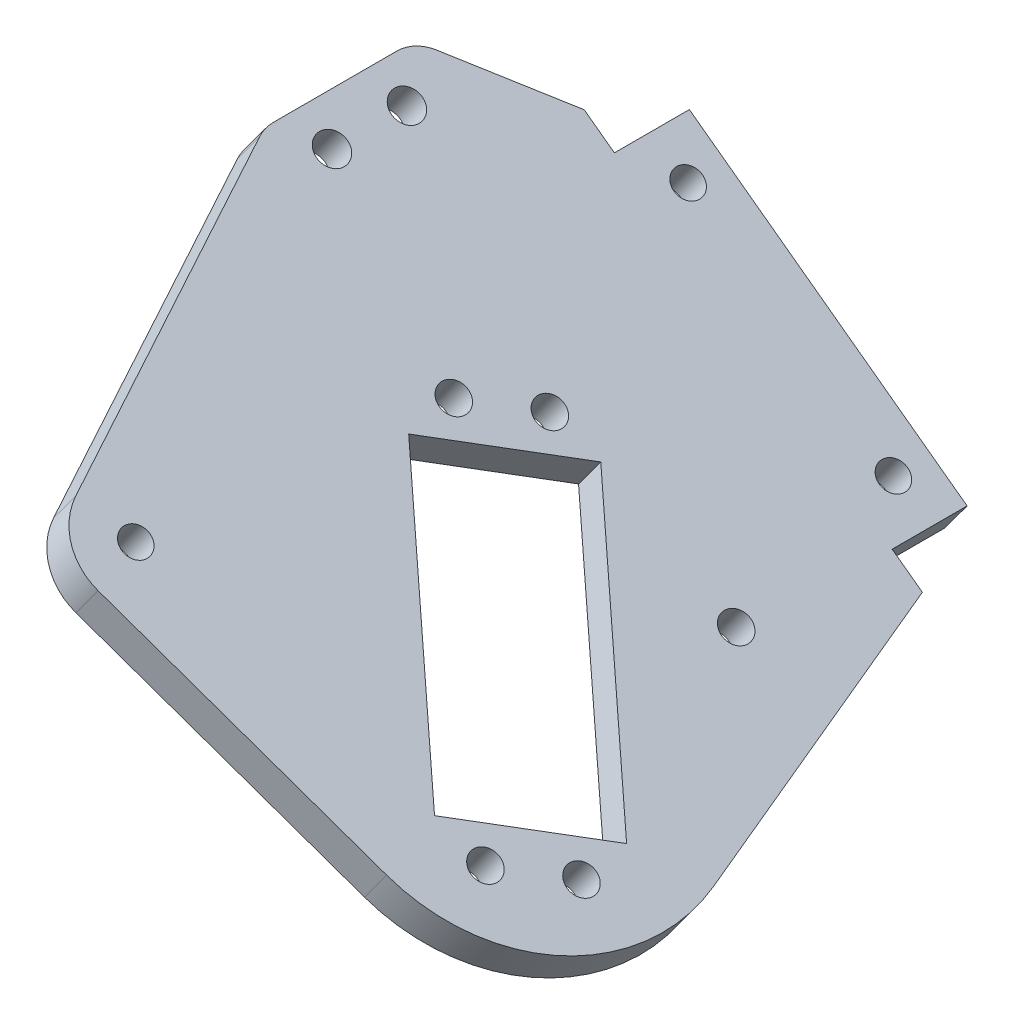
ISO-10303-21;
HEADER;
FILE_DESCRIPTION(('STEP AP214'),'2;1');
FILE_NAME('part.step','',(''),(''),'','','');
FILE_SCHEMA(('AUTOMOTIVE_DESIGN { 1 0 10303 214 1 1 1 1 }'));
ENDSEC;
DATA;
#1=APPLICATION_CONTEXT('core data for automotive mechanical design processes');
#2=APPLICATION_PROTOCOL_DEFINITION('international standard','automotive_design',2000,#1);
#3=PRODUCT_CONTEXT('',#1,'mechanical');
#4=PRODUCT('Part','Part','',(#3));
#5=PRODUCT_RELATED_PRODUCT_CATEGORY('part','',(#4));
#6=PRODUCT_DEFINITION_FORMATION('','',#4);
#7=PRODUCT_DEFINITION_CONTEXT('part definition',#1,'design');
#8=PRODUCT_DEFINITION('design','',#6,#7);
#9=PRODUCT_DEFINITION_SHAPE('','',#8);
#10=(LENGTH_UNIT() NAMED_UNIT(*) SI_UNIT(.MILLI.,.METRE.));
#11=(NAMED_UNIT(*) PLANE_ANGLE_UNIT() SI_UNIT($,.RADIAN.));
#12=(NAMED_UNIT(*) SI_UNIT($,.STERADIAN.) SOLID_ANGLE_UNIT());
#13=UNCERTAINTY_MEASURE_WITH_UNIT(LENGTH_MEASURE(1.E-05),#10,'distance_accuracy_value','');
#14=(GEOMETRIC_REPRESENTATION_CONTEXT(3) GLOBAL_UNCERTAINTY_ASSIGNED_CONTEXT((#13)) GLOBAL_UNIT_ASSIGNED_CONTEXT((#10,
#11,#12)) REPRESENTATION_CONTEXT('',''));
#15=CARTESIAN_POINT('',(0.,0.,0.));
#16=DIRECTION('',(0.,0.,1.));
#17=DIRECTION('',(1.,0.,0.));
#18=AXIS2_PLACEMENT_3D('',#15,#16,#17);
#19=CARTESIAN_POINT('',(-2.56826288802433,-38.4615240936028,78.4668397417343));
#20=DIRECTION('',(-0.592700679914284,-0.805422810720646,0.));
#21=DIRECTION('',(0.805422810720646,-0.592700679914284,0.));
#22=AXIS2_PLACEMENT_3D('',#19,#20,#21);
#23=PLANE('',#22);
#24=CARTESIAN_POINT('',(-30.2783400486142,-18.0700212022658,102.557050068478));
#25=DIRECTION('',(-0.592700679914284,-0.805422810720646,0.));
#26=DIRECTION('',(0.805422810720646,-0.592700679914284,0.));
#27=AXIS2_PLACEMENT_3D('',#24,#25,#26);
#28=CIRCLE('',#27,1.89999999999999);
#29=CARTESIAN_POINT('',(-28.748036708245,-19.1961524941029,102.557050068478));
#30=VERTEX_POINT('',#29);
#31=EDGE_CURVE('E261',#30,#30,#28,.T.);
#32=ORIENTED_EDGE('',*,*,#31,.T.);
#33=EDGE_LOOP('',(#32));
#34=FACE_BOUND('',#33,.T.);
#35=DIRECTION('',(-0.659763741918804,0.485511973603262,-0.573576436351044));
#36=VECTOR('',#35,1.);
#37=CARTESIAN_POINT('',(8.64908998645359,-46.7162352677162,76.0110836623548));
#38=LINE('',#37,#36);
#39=CARTESIAN_POINT('',(8.6490899864536,-46.7162352677162,76.0110836623548));
#40=VERTEX_POINT('',#39);
#41=CARTESIAN_POINT('',(-17.7414596902986,-27.2957563235857,53.068026208313));
#42=VERTEX_POINT('',#41);
#43=EDGE_CURVE('E267',#40,#42,#38,.T.);
#44=ORIENTED_EDGE('',*,*,#43,.F.);
#45=DIRECTION('',(-0.461971545528991,0.339959143808075,0.819152044288993));
#46=VECTOR('',#45,1.);
#47=CARTESIAN_POINT('',(8.64908998645359,-46.7162352677162,76.0110836623548));
#48=LINE('',#47,#46);
#49=CARTESIAN_POINT('',(-0.590340924126203,-39.9170523915547,92.3941245481346));
#50=VERTEX_POINT('',#49);
#51=EDGE_CURVE('E433',#40,#50,#48,.T.);
#52=ORIENTED_EDGE('',*,*,#51,.T.);
#53=DIRECTION('',(-0.659763741918804,0.485511973603262,-0.573576436351044));
#54=VECTOR('',#53,1.);
#55=CARTESIAN_POINT('',(-0.590340924126207,-39.9170523915547,92.3941245481346));
#56=LINE('',#55,#54);
#57=CARTESIAN_POINT('',(-26.9808906008784,-20.4965734474242,69.4510670940928));
#58=VERTEX_POINT('',#57);
#59=EDGE_CURVE('E440',#50,#58,#56,.T.);
#60=ORIENTED_EDGE('',*,*,#59,.T.);
#61=DIRECTION('',(-0.46197154552899,0.339959143808076,0.819152044288993));
#62=VECTOR('',#61,1.);
#63=CARTESIAN_POINT('',(-17.7414596902986,-27.2957563235857,53.068026208313));
#64=LINE('',#63,#62);
#65=EDGE_CURVE('E442',#42,#58,#64,.T.);
#66=ORIENTED_EDGE('',*,*,#65,.F.);
#67=EDGE_LOOP('',(#44,#52,#60,#66));
#68=FACE_BOUND('',#67,.T.);
#69=CARTESIAN_POINT('',(4.68845364215337,-43.8016519918097,90.8794582902694));
#70=DIRECTION('',(-0.592700679914284,-0.805422810720646,0.));
#71=DIRECTION('',(0.805422810720646,-0.592700679914284,0.));
#72=AXIS2_PLACEMENT_3D('',#69,#70,#71);
#73=CIRCLE('',#72,1.94999999999999);
#74=CARTESIAN_POINT('',(6.25902812305863,-44.9574183176426,90.8794582902694));
#75=VERTEX_POINT('',#74);
#76=EDGE_CURVE('E264',#75,#75,#73,.T.);
#77=ORIENTED_EDGE('',*,*,#76,.T.);
#78=EDGE_LOOP('',(#77));
#79=FACE_BOUND('',#78,.T.);
#80=CARTESIAN_POINT('',(9.30816909744327,-47.2012434298905,82.6879378473795));
#81=DIRECTION('',(-0.592700679914284,-0.805422810720646,0.));
#82=DIRECTION('',(0.805422810720646,-0.592700679914284,0.));
#83=AXIS2_PLACEMENT_3D('',#80,#81,#82);
#84=CIRCLE('',#83,1.95);
#85=CARTESIAN_POINT('',(10.8787435783485,-48.3570097557233,82.6879378473795));
#86=VERTEX_POINT('',#85);
#87=EDGE_CURVE('E268',#86,#86,#84,.T.);
#88=ORIENTED_EDGE('',*,*,#87,.T.);
#89=EDGE_LOOP('',(#88));
#90=FACE_BOUND('',#89,.T.);
#91=CARTESIAN_POINT('',(-27.639969711868,-20.0115652852499,62.7742129090682));
#92=DIRECTION('',(-0.592700679914284,-0.805422810720646,0.));
#93=DIRECTION('',(0.805422810720646,-0.592700679914284,0.));
#94=AXIS2_PLACEMENT_3D('',#91,#92,#93);
#95=CIRCLE('',#94,1.95000000000001);
#96=CARTESIAN_POINT('',(-26.0693952309628,-21.1673316110827,62.7742129090682));
#97=VERTEX_POINT('',#96);
#98=EDGE_CURVE('E271',#97,#97,#95,.T.);
#99=ORIENTED_EDGE('',*,*,#98,.T.);
#100=EDGE_LOOP('',(#99));
#101=FACE_BOUND('',#100,.T.);
#102=CARTESIAN_POINT('',(-23.0202542565781,-23.4111567233307,54.5826924661782));
#103=DIRECTION('',(-0.592700679914284,-0.805422810720646,0.));
#104=DIRECTION('',(0.805422810720646,-0.592700679914284,0.));
#105=AXIS2_PLACEMENT_3D('',#102,#103,#104);
#106=CIRCLE('',#105,1.95);
#107=CARTESIAN_POINT('',(-21.4496797756728,-24.5669230491635,54.5826924661782));
#108=VERTEX_POINT('',#107);
#109=EDGE_CURVE('E274',#108,#108,#106,.T.);
#110=ORIENTED_EDGE('',*,*,#109,.T.);
#111=EDGE_LOOP('',(#110));
#112=FACE_BOUND('',#111,.T.);
#113=CARTESIAN_POINT('',(-1.54347026136005,-39.2156563065353,51.2));
#114=DIRECTION('',(-0.592700679914284,-0.805422810720646,0.));
#115=DIRECTION('',(0.805422810720646,-0.592700679914284,0.));
#116=AXIS2_PLACEMENT_3D('',#113,#114,#115);
#117=CIRCLE('',#116,1.95);
#118=CARTESIAN_POINT('',(0.0271042195452162,-40.3714226323681,51.2));
#119=VERTEX_POINT('',#118);
#120=EDGE_CURVE('E277',#119,#119,#117,.T.);
#121=ORIENTED_EDGE('',*,*,#120,.T.);
#122=EDGE_LOOP('',(#121));
#123=FACE_BOUND('',#122,.T.);
#124=CARTESIAN_POINT('',(-48.8933107770379,-4.37149458933136,57.7701769743577));
#125=DIRECTION('',(-0.592700679914284,-0.805422810720646,0.));
#126=DIRECTION('',(0.805422810720646,-0.592700679914284,0.));
#127=AXIS2_PLACEMENT_3D('',#124,#125,#126);
#128=CIRCLE('',#127,2.04873855011629);
#129=CARTESIAN_POINT('',(-47.2432100155715,-5.58578332095189,57.7701769743577));
#130=VERTEX_POINT('',#129);
#131=EDGE_CURVE('E280',#130,#130,#128,.T.);
#132=ORIENTED_EDGE('',*,*,#131,.T.);
#133=EDGE_LOOP('',(#132));
#134=FACE_BOUND('',#133,.T.);
#135=CARTESIAN_POINT('',(-48.8933107770379,-4.37149458933135,47.7701769743577));
#136=DIRECTION('',(-0.592700679914284,-0.805422810720646,0.));
#137=DIRECTION('',(0.805422810720646,-0.592700679914284,0.));
#138=AXIS2_PLACEMENT_3D('',#135,#136,#137);
#139=CIRCLE('',#138,2.04873855011629);
#140=CARTESIAN_POINT('',(-47.2432100155715,-5.58578332095188,47.7701769743577));
#141=VERTEX_POINT('',#140);
#142=EDGE_CURVE('E283',#141,#141,#139,.T.);
#143=ORIENTED_EDGE('',*,*,#142,.T.);
#144=EDGE_LOOP('',(#143));
#145=FACE_BOUND('',#144,.T.);
#146=CARTESIAN_POINT('',(-48.8933107770378,-4.37149458933134,45.1017152651327));
#147=DIRECTION('',(0.592700679914284,0.805422810720646,0.));
#148=DIRECTION('',(-0.805422810720646,0.592700679914284,0.));
#149=AXIS2_PLACEMENT_3D('',#146,#147,#148);
#150=CIRCLE('',#149,5.);
#151=CARTESIAN_POINT('',(-52.9204248306411,-1.40799118975992,45.1017152651327));
#152=VERTEX_POINT('',#151);
#153=CARTESIAN_POINT('',(-51.4818897934885,-2.46659132282289,41.2714930495378));
#154=VERTEX_POINT('',#153);
#155=EDGE_CURVE('E146',#152,#154,#150,.F.);
#156=ORIENTED_EDGE('',*,*,#155,.F.);
#157=DIRECTION('',(0.,0.,1.));
#158=VECTOR('',#157,1.);
#159=CARTESIAN_POINT('',(-52.9204248306411,-1.40799118975993,42.7701769743577));
#160=LINE('',#159,#158);
#161=CARTESIAN_POINT('',(-52.9204248306411,-1.40799118975994,61.5783195911399));
#162=VERTEX_POINT('',#161);
#163=EDGE_CURVE('E138',#152,#162,#160,.T.);
#164=ORIENTED_EDGE('',*,*,#163,.T.);
#165=CARTESIAN_POINT('',(-48.8933107770378,-4.37149458933137,61.5783195911399));
#166=DIRECTION('',(-0.592700679914284,-0.805422810720646,0.));
#167=DIRECTION('',(0.805422810720646,-0.592700679914284,0.));
#168=AXIS2_PLACEMENT_3D('',#165,#166,#167);
#169=CIRCLE('',#168,5.);
#170=CARTESIAN_POINT('',(-52.4873817730961,-1.72666221722866,63.8338717183962));
#171=VERTEX_POINT('',#170);
#172=EDGE_CURVE('E287',#171,#162,#169,.T.);
#173=ORIENTED_EDGE('',*,*,#172,.F.);
#174=DIRECTION('',(0.363334626812338,-0.267373455881381,0.892468141755876));
#175=VECTOR('',#174,1.);
#176=CARTESIAN_POINT('',(-52.9204248306411,-1.40799118975999,62.7701769743577));
#177=LINE('',#176,#175);
#178=CARTESIAN_POINT('',(-35.6551627886434,-14.1132838819725,105.179281954898));
#179=VERTEX_POINT('',#178);
#180=EDGE_CURVE('E174',#179,#171,#177,.F.);
#181=ORIENTED_EDGE('',*,*,#180,.F.);
#182=CARTESIAN_POINT('',(-29.9046491949502,-18.3450156773368,101.570398551288));
#183=DIRECTION('',(-0.592700679914284,-0.805422810720646,0.));
#184=DIRECTION('',(0.805422810720646,-0.592700679914284,0.));
#185=AXIS2_PLACEMENT_3D('',#182,#183,#184);
#186=CIRCLE('',#185,8.);
#187=CARTESIAN_POINT('',(-28.4754880593754,-19.3967176722237,109.371130655553));
#188=VERTEX_POINT('',#187);
#189=EDGE_CURVE('E291',#188,#179,#186,.T.);
#190=ORIENTED_EDGE('',*,*,#189,.F.);
#191=DIRECTION('',(-0.785360947137005,0.577937402753393,0.221802933278009));
#192=VECTOR('',#191,1.);
#193=CARTESIAN_POINT('',(1.54057537675339,-41.4851673289026,100.893944541497));
#194=LINE('',#193,#192);
#195=CARTESIAN_POINT('',(1.54057537675339,-41.4851673289026,100.893944541497));
#196=VERTEX_POINT('',#195);
#197=EDGE_CURVE('E178',#196,#188,#194,.T.);
#198=ORIENTED_EDGE('',*,*,#197,.F.);
#199=CARTESIAN_POINT('',(-2.56826288802433,-38.4615240936028,78.4668397417343));
#200=DIRECTION('',(0.592700679914284,0.805422810720646,0.));
#201=DIRECTION('',(-0.805422810720646,0.592700679914284,0.));
#202=AXIS2_PLACEMENT_3D('',#199,#200,#201);
#203=CIRCLE('',#202,23.);
#204=CARTESIAN_POINT('',(14.8392841644529,-51.2715225643584,70.600376445244));
#205=VERTEX_POINT('',#204);
#206=EDGE_CURVE('E182',#205,#196,#203,.F.);
#207=ORIENTED_EDGE('',*,*,#206,.F.);
#208=DIRECTION('',(0.275470825160435,-0.202715571493502,0.93969262078591));
#209=VECTOR('',#208,1.);
#210=CARTESIAN_POINT('',(3.28906660296383,-42.771860386021,31.2));
#211=LINE('',#210,#209);
#212=CARTESIAN_POINT('',(3.28906660296384,-42.771860386021,31.2));
#213=VERTEX_POINT('',#212);
#214=EDGE_CURVE('E183',#205,#213,#211,.F.);
#215=ORIENTED_EDGE('',*,*,#214,.T.);
#216=DIRECTION('',(-0.805422810720647,0.592700679914283,0.));
#217=VECTOR('',#216,1.);
#218=CARTESIAN_POINT('',(3.28906660296386,-42.771860386021,31.2));
#219=LINE('',#218,#217);
#220=CARTESIAN_POINT('',(-0.738047450639377,-39.8083569864496,31.2));
#221=VERTEX_POINT('',#220);
#222=EDGE_CURVE('E190',#213,#221,#219,.T.);
#223=ORIENTED_EDGE('',*,*,#222,.T.);
#224=DIRECTION('',(0.,0.,1.));
#225=VECTOR('',#224,1.);
#226=CARTESIAN_POINT('',(-0.73804745063938,-39.8083569864496,31.2));
#227=LINE('',#226,#225);
#228=CARTESIAN_POINT('',(-0.738047450639381,-39.8083569864496,21.2));
#229=VERTEX_POINT('',#228);
#230=EDGE_CURVE('E196',#221,#229,#227,.F.);
#231=ORIENTED_EDGE('',*,*,#230,.T.);
#232=DIRECTION('',(-0.805422810720646,0.592700679914284,0.));
#233=VECTOR('',#232,1.);
#234=CARTESIAN_POINT('',(-0.738047450639375,-39.8083569864496,21.2));
#235=LINE('',#234,#233);
#236=CARTESIAN_POINT('',(-37.787496743789,-12.5441257103926,21.2));
#237=VERTEX_POINT('',#236);
#238=EDGE_CURVE('E202',#229,#237,#235,.T.);
#239=ORIENTED_EDGE('',*,*,#238,.T.);
#240=DIRECTION('',(0.,0.,1.));
#241=VECTOR('',#240,1.);
#242=CARTESIAN_POINT('',(-37.787496743789,-12.5441257103926,21.2));
#243=LINE('',#242,#241);
#244=CARTESIAN_POINT('',(-37.7874967437891,-12.5441257103925,31.2));
#245=VERTEX_POINT('',#244);
#246=EDGE_CURVE('E208',#237,#245,#243,.T.);
#247=ORIENTED_EDGE('',*,*,#246,.T.);
#248=DIRECTION('',(-0.805422810720646,0.592700679914283,0.));
#249=VECTOR('',#248,1.);
#250=CARTESIAN_POINT('',(-37.7874967437891,-12.5441257103925,31.2));
#251=LINE('',#250,#249);
#252=CARTESIAN_POINT('',(-41.8146107973923,-9.5806223108211,31.2));
#253=VERTEX_POINT('',#252);
#254=EDGE_CURVE('E149',#245,#253,#251,.T.);
#255=ORIENTED_EDGE('',*,*,#254,.T.);
#256=DIRECTION('',(-0.616989668513819,0.454035062281176,0.642787609686541));
#257=VECTOR('',#256,1.);
#258=CARTESIAN_POINT('',(-41.8146107973923,-9.5806223108211,31.2));
#259=LINE('',#258,#257);
#260=EDGE_CURVE('E143',#253,#154,#259,.T.);
#261=ORIENTED_EDGE('',*,*,#260,.T.);
#262=EDGE_LOOP('',(#156,#164,#173,#181,#190,#198,#207,#215,#223,#231,#239,#247,#255,#261));
#263=FACE_BOUND('',#262,.T.);
#264=CARTESIAN_POINT('',(-32.9549598794652,-16.1003297898782,26.2));
#265=DIRECTION('',(0.592700679914284,0.805422810720646,0.));
#266=DIRECTION('',(-0.805422810720646,0.592700679914284,0.));
#267=AXIS2_PLACEMENT_3D('',#264,#265,#266);
#268=CIRCLE('',#267,1.9);
#269=CARTESIAN_POINT('',(-34.4852632198344,-14.9741984980411,26.2));
#270=VERTEX_POINT('',#269);
#271=EDGE_CURVE('E173',#270,#270,#268,.F.);
#272=ORIENTED_EDGE('',*,*,#271,.T.);
#273=EDGE_LOOP('',(#272));
#274=FACE_BOUND('',#273,.T.);
#275=CARTESIAN_POINT('',(-5.57058431496324,-36.2521529069639,26.2));
#276=DIRECTION('',(0.592700679914284,0.805422810720646,0.));
#277=DIRECTION('',(-0.805422810720646,0.592700679914284,0.));
#278=AXIS2_PLACEMENT_3D('',#275,#276,#277);
#279=CIRCLE('',#278,1.9);
#280=CARTESIAN_POINT('',(-7.10088765533247,-35.1260216151267,26.2));
#281=VERTEX_POINT('',#280);
#282=EDGE_CURVE('E19',#281,#281,#279,.F.);
#283=ORIENTED_EDGE('',*,*,#282,.T.);
#284=EDGE_LOOP('',(#283));
#285=FACE_BOUND('',#284,.T.);
#286=ADVANCED_FACE('F16',(#34,#68,#79,#90,#101,#112,#123,#134,#145,#263,#274,#285),#23,.F.);
#287=CARTESIAN_POINT('',(-9.71948907436323,-41.8901125820084,26.2));
#288=DIRECTION('',(0.592700679914284,0.805422810720646,0.));
#289=DIRECTION('',(-0.805422810720646,0.592700679914284,0.));
#290=AXIS2_PLACEMENT_3D('',#287,#288,#289);
#291=CYLINDRICAL_SURFACE('',#290,1.9);
#292=CARTESIAN_POINT('',(-8.53408771453465,-40.2792669605671,26.2));
#293=DIRECTION('',(0.592700679914284,0.805422810720646,0.));
#294=DIRECTION('',(-0.805422810720646,0.592700679914284,0.));
#295=AXIS2_PLACEMENT_3D('',#292,#293,#294);
#296=CIRCLE('',#295,1.9);
#297=CARTESIAN_POINT('',(-10.0643910549039,-39.15313566873,26.2));
#298=VERTEX_POINT('',#297);
#299=EDGE_CURVE('E258',#298,#298,#296,.T.);
#300=ORIENTED_EDGE('',*,*,#299,.F.);
#301=EDGE_LOOP('',(#300));
#302=FACE_BOUND('',#301,.T.);
#303=ORIENTED_EDGE('',*,*,#282,.F.);
#304=EDGE_LOOP('',(#303));
#305=FACE_BOUND('',#304,.T.);
#306=ADVANCED_FACE('F301',(#302,#305),#291,.F.);
#307=CARTESIAN_POINT('',(-37.1038646388652,-21.7382894649228,26.2));
#308=DIRECTION('',(0.592700679914284,0.805422810720646,0.));
#309=DIRECTION('',(-0.805422810720646,0.592700679914284,0.));
#310=AXIS2_PLACEMENT_3D('',#307,#308,#309);
#311=CYLINDRICAL_SURFACE('',#310,1.9);
#312=CARTESIAN_POINT('',(-35.9184632790366,-20.1274438434815,26.2));
#313=DIRECTION('',(0.592700679914284,0.805422810720646,0.));
#314=DIRECTION('',(-0.805422810720646,0.592700679914284,0.));
#315=AXIS2_PLACEMENT_3D('',#312,#313,#314);
#316=CIRCLE('',#315,1.9);
#317=CARTESIAN_POINT('',(-37.4487666194059,-19.0013125516443,26.2));
#318=VERTEX_POINT('',#317);
#319=EDGE_CURVE('E255',#318,#318,#316,.T.);
#320=ORIENTED_EDGE('',*,*,#319,.F.);
#321=EDGE_LOOP('',(#320));
#322=FACE_BOUND('',#321,.T.);
#323=ORIENTED_EDGE('',*,*,#271,.F.);
#324=EDGE_LOOP('',(#323));
#325=FACE_BOUND('',#324,.T.);
#326=ADVANCED_FACE('F303',(#322,#325),#311,.F.);
#327=CARTESIAN_POINT('',(-55.8839282302125,-5.43510524336316,42.7701769743577));
#328=DIRECTION('',(0.805422810720646,-0.592700679914284,0.));
#329=DIRECTION('',(0.592700679914284,0.805422810720646,0.));
#330=AXIS2_PLACEMENT_3D('',#327,#328,#329);
#331=PLANE('',#330);
#332=DIRECTION('',(0.592700679914284,0.805422810720646,0.));
#333=VECTOR('',#332,1.);
#334=CARTESIAN_POINT('',(-55.8839282302125,-5.43510524336317,45.1017152651327));
#335=LINE('',#334,#333);
#336=CARTESIAN_POINT('',(-55.8839282302125,-5.43510524336316,45.1017152651327));
#337=VERTEX_POINT('',#336);
#338=EDGE_CURVE('E159',#337,#152,#335,.T.);
#339=ORIENTED_EDGE('',*,*,#338,.F.);
#340=DIRECTION('',(0.,0.,1.));
#341=VECTOR('',#340,1.);
#342=CARTESIAN_POINT('',(-55.8839282302125,-5.43510524336318,78.4668397417343));
#343=LINE('',#342,#341);
#344=CARTESIAN_POINT('',(-55.8839282302125,-5.43510524336317,61.5783195911399));
#345=VERTEX_POINT('',#344);
#346=EDGE_CURVE('E254',#345,#337,#343,.F.);
#347=ORIENTED_EDGE('',*,*,#346,.F.);
#348=DIRECTION('',(-0.592700679914284,-0.805422810720646,0.));
#349=VECTOR('',#348,1.);
#350=CARTESIAN_POINT('',(-55.8839282302125,-5.43510524336318,61.5783195911399));
#351=LINE('',#350,#349);
#352=EDGE_CURVE('E286',#162,#345,#351,.T.);
#353=ORIENTED_EDGE('',*,*,#352,.F.);
#354=ORIENTED_EDGE('',*,*,#163,.F.);
#355=EDGE_LOOP('',(#339,#347,#353,#354));
#356=FACE_BOUND('',#355,.T.);
#357=ADVANCED_FACE('F310',(#356),#331,.F.);
#358=CARTESIAN_POINT('',(-51.8568141766093,-8.39860864293458,45.1017152651327));
#359=DIRECTION('',(0.592700679914284,0.805422810720646,0.));
#360=DIRECTION('',(-0.805422810720646,0.592700679914284,0.));
#361=AXIS2_PLACEMENT_3D('',#358,#359,#360);
#362=CYLINDRICAL_SURFACE('',#361,5.);
#363=ORIENTED_EDGE('',*,*,#155,.T.);
#364=DIRECTION('',(-0.592700679914284,-0.805422810720646,0.));
#365=VECTOR('',#364,1.);
#366=CARTESIAN_POINT('',(-51.4818897934885,-2.4665913228229,41.2714930495378));
#367=LINE('',#366,#365);
#368=CARTESIAN_POINT('',(-54.44539319306,-6.49370537642613,41.2714930495378));
#369=VERTEX_POINT('',#368);
#370=EDGE_CURVE('E153',#154,#369,#367,.T.);
#371=ORIENTED_EDGE('',*,*,#370,.T.);
#372=CARTESIAN_POINT('',(-51.8568141766093,-8.39860864293458,45.1017152651327));
#373=DIRECTION('',(0.592700679914284,0.805422810720646,0.));
#374=DIRECTION('',(-0.805422810720646,0.592700679914284,0.));
#375=AXIS2_PLACEMENT_3D('',#372,#373,#374);
#376=CIRCLE('',#375,5.);
#377=EDGE_CURVE('E252',#337,#369,#376,.F.);
#378=ORIENTED_EDGE('',*,*,#377,.F.);
#379=ORIENTED_EDGE('',*,*,#338,.T.);
#380=EDGE_LOOP('',(#363,#371,#378,#379));
#381=FACE_BOUND('',#380,.T.);
#382=ADVANCED_FACE('F156',(#381),#362,.T.);
#383=CARTESIAN_POINT('',(-44.7781141969637,-13.6077363644243,31.2));
#384=DIRECTION('',(0.517715803290139,-0.38098065330169,0.766044443118977));
#385=DIRECTION('',(0.828529656168727,0.,-0.559945183789388));
#386=AXIS2_PLACEMENT_3D('',#383,#384,#385);
#387=PLANE('',#386);
#388=ORIENTED_EDGE('',*,*,#370,.F.);
#389=ORIENTED_EDGE('',*,*,#260,.F.);
#390=DIRECTION('',(-0.592700679914283,-0.805422810720646,0.));
#391=VECTOR('',#390,1.);
#392=CARTESIAN_POINT('',(-41.8146107973923,-9.5806223108211,31.2));
#393=LINE('',#392,#391);
#394=CARTESIAN_POINT('',(-44.7781141969638,-13.6077363644243,31.2));
#395=VERTEX_POINT('',#394);
#396=EDGE_CURVE('E165',#253,#395,#393,.T.);
#397=ORIENTED_EDGE('',*,*,#396,.T.);
#398=DIRECTION('',(0.616989668513818,-0.454035062281176,-0.642787609686541));
#399=VECTOR('',#398,1.);
#400=CARTESIAN_POINT('',(-54.44539319306,-6.49370537642613,41.2714930495378));
#401=LINE('',#400,#399);
#402=EDGE_CURVE('E163',#369,#395,#401,.T.);
#403=ORIENTED_EDGE('',*,*,#402,.F.);
#404=EDGE_LOOP('',(#388,#389,#397,#403));
#405=FACE_BOUND('',#404,.T.);
#406=ADVANCED_FACE('F161',(#405),#387,.F.);
#407=CARTESIAN_POINT('',(-40.7510001433605,-16.5712397639957,31.2));
#408=DIRECTION('',(0.,0.,1.));
#409=DIRECTION('',(0.,-1.,0.));
#410=AXIS2_PLACEMENT_3D('',#407,#408,#409);
#411=PLANE('',#410);
#412=DIRECTION('',(0.592700679914284,0.805422810720646,0.));
#413=VECTOR('',#412,1.);
#414=CARTESIAN_POINT('',(-40.7510001433605,-16.5712397639957,31.2));
#415=LINE('',#414,#413);
#416=CARTESIAN_POINT('',(-40.7510001433605,-16.5712397639957,31.1999999999999));
#417=VERTEX_POINT('',#416);
#418=EDGE_CURVE('E210',#245,#417,#415,.F.);
#419=ORIENTED_EDGE('',*,*,#418,.T.);
#420=DIRECTION('',(0.805422810720646,-0.592700679914284,0.));
#421=VECTOR('',#420,1.);
#422=CARTESIAN_POINT('',(-5.53176628759573,-42.488638147206,31.1999999999999));
#423=LINE('',#422,#421);
#424=EDGE_CURVE('E490',#395,#417,#423,.T.);
#425=ORIENTED_EDGE('',*,*,#424,.F.);
#426=ORIENTED_EDGE('',*,*,#396,.F.);
#427=ORIENTED_EDGE('',*,*,#254,.F.);
#428=EDGE_LOOP('',(#419,#425,#426,#427));
#429=FACE_BOUND('',#428,.T.);
#430=ADVANCED_FACE('F409',(#429),#411,.F.);
#431=CARTESIAN_POINT('',(-40.7510001433604,-16.5712397639958,21.2));
#432=DIRECTION('',(0.805422810720646,-0.592700679914284,0.));
#433=DIRECTION('',(0.592700679914284,0.805422810720646,0.));
#434=AXIS2_PLACEMENT_3D('',#431,#432,#433);
#435=PLANE('',#434);
#436=DIRECTION('',(-0.592700679914284,-0.805422810720646,0.));
#437=VECTOR('',#436,1.);
#438=CARTESIAN_POINT('',(-37.787496743789,-12.5441257103926,21.2));
#439=LINE('',#438,#437);
#440=CARTESIAN_POINT('',(-40.7510001433605,-16.5712397639958,21.2));
#441=VERTEX_POINT('',#440);
#442=EDGE_CURVE('E205',#237,#441,#439,.T.);
#443=ORIENTED_EDGE('',*,*,#442,.T.);
#444=DIRECTION('',(0.,0.,1.));
#445=VECTOR('',#444,1.);
#446=CARTESIAN_POINT('',(-40.7510001433605,-16.5712397639958,78.4668397417343));
#447=LINE('',#446,#445);
#448=EDGE_CURVE('E482',#417,#441,#447,.F.);
#449=ORIENTED_EDGE('',*,*,#448,.F.);
#450=ORIENTED_EDGE('',*,*,#418,.F.);
#451=ORIENTED_EDGE('',*,*,#246,.F.);
#452=EDGE_LOOP('',(#443,#449,#450,#451));
#453=FACE_BOUND('',#452,.T.);
#454=ADVANCED_FACE('F405',(#453),#435,.F.);
#455=CARTESIAN_POINT('',(-3.70155085021079,-43.8354710400528,21.2));
#456=DIRECTION('',(0.,0.,1.));
#457=DIRECTION('',(0.,-1.,0.));
#458=AXIS2_PLACEMENT_3D('',#455,#456,#457);
#459=PLANE('',#458);
#460=DIRECTION('',(-0.592700679914284,-0.805422810720646,0.));
#461=VECTOR('',#460,1.);
#462=CARTESIAN_POINT('',(-3.7015508502108,-43.8354710400528,21.2));
#463=LINE('',#462,#461);
#464=CARTESIAN_POINT('',(-3.70155085021079,-43.8354710400528,21.1999999999999));
#465=VERTEX_POINT('',#464);
#466=EDGE_CURVE('E199',#229,#465,#463,.T.);
#467=ORIENTED_EDGE('',*,*,#466,.T.);
#468=DIRECTION('',(0.805422810720646,-0.592700679914284,0.));
#469=VECTOR('',#468,1.);
#470=CARTESIAN_POINT('',(-5.53176628759573,-42.488638147206,21.2));
#471=LINE('',#470,#469);
#472=EDGE_CURVE('E474',#441,#465,#471,.T.);
#473=ORIENTED_EDGE('',*,*,#472,.F.);
#474=ORIENTED_EDGE('',*,*,#442,.F.);
#475=ORIENTED_EDGE('',*,*,#238,.F.);
#476=EDGE_LOOP('',(#467,#473,#474,#475));
#477=FACE_BOUND('',#476,.T.);
#478=ADVANCED_FACE('F401',(#477),#459,.F.);
#479=CARTESIAN_POINT('',(-3.70155085021079,-43.8354710400528,31.2));
#480=DIRECTION('',(-0.805422810720646,0.592700679914284,0.));
#481=DIRECTION('',(-0.592700679914284,-0.805422810720646,0.));
#482=AXIS2_PLACEMENT_3D('',#479,#480,#481);
#483=PLANE('',#482);
#484=DIRECTION('',(-0.592700679914284,-0.805422810720646,0.));
#485=VECTOR('',#484,1.);
#486=CARTESIAN_POINT('',(-0.738047450639375,-39.8083569864496,31.2));
#487=LINE('',#486,#485);
#488=CARTESIAN_POINT('',(-3.7015508502108,-43.8354710400528,31.1999999999999));
#489=VERTEX_POINT('',#488);
#490=EDGE_CURVE('E193',#221,#489,#487,.T.);
#491=ORIENTED_EDGE('',*,*,#490,.T.);
#492=DIRECTION('',(0.,0.,1.));
#493=VECTOR('',#492,1.);
#494=CARTESIAN_POINT('',(-3.70155085021082,-43.8354710400528,78.4668397417343));
#495=LINE('',#494,#493);
#496=EDGE_CURVE('E466',#465,#489,#495,.T.);
#497=ORIENTED_EDGE('',*,*,#496,.F.);
#498=ORIENTED_EDGE('',*,*,#466,.F.);
#499=ORIENTED_EDGE('',*,*,#230,.F.);
#500=EDGE_LOOP('',(#491,#497,#498,#499));
#501=FACE_BOUND('',#500,.T.);
#502=ADVANCED_FACE('F397',(#501),#483,.F.);
#503=CARTESIAN_POINT('',(-3.70155085021079,-43.8354710400528,31.2));
#504=DIRECTION('',(0.,0.,1.));
#505=DIRECTION('',(0.,-1.,0.));
#506=AXIS2_PLACEMENT_3D('',#503,#504,#505);
#507=PLANE('',#506);
#508=DIRECTION('',(-0.592700679914283,-0.805422810720646,0.));
#509=VECTOR('',#508,1.);
#510=CARTESIAN_POINT('',(0.325563203392439,-46.7989744396242,31.2));
#511=LINE('',#510,#509);
#512=CARTESIAN_POINT('',(0.325563203392438,-46.7989744396242,31.1999999999999));
#513=VERTEX_POINT('',#512);
#514=EDGE_CURVE('E187',#213,#513,#511,.T.);
#515=ORIENTED_EDGE('',*,*,#514,.T.);
#516=DIRECTION('',(0.805422810720646,-0.592700679914284,0.));
#517=VECTOR('',#516,1.);
#518=CARTESIAN_POINT('',(-5.53176628759573,-42.488638147206,31.1999999999999));
#519=LINE('',#518,#517);
#520=EDGE_CURVE('E463',#489,#513,#519,.T.);
#521=ORIENTED_EDGE('',*,*,#520,.F.);
#522=ORIENTED_EDGE('',*,*,#490,.F.);
#523=ORIENTED_EDGE('',*,*,#222,.F.);
#524=EDGE_LOOP('',(#515,#521,#522,#523));
#525=FACE_BOUND('',#524,.T.);
#526=ADVANCED_FACE('F393',(#525),#507,.F.);
#527=CARTESIAN_POINT('',(0.325563203392438,-46.7989744396242,31.2));
#528=DIRECTION('',(-0.756849871846838,0.556956455250244,0.342020143325664));
#529=DIRECTION('',(-0.592700679914283,-0.805422810720646,0.));
#530=AXIS2_PLACEMENT_3D('',#527,#528,#529);
#531=PLANE('',#530);
#532=DIRECTION('',(0.592700679914284,0.805422810720646,0.));
#533=VECTOR('',#532,1.);
#534=CARTESIAN_POINT('',(11.8757807648815,-55.2986366179616,70.600376445244));
#535=LINE('',#534,#533);
#536=CARTESIAN_POINT('',(11.8757807648815,-55.2986366179617,70.600376445244));
#537=VERTEX_POINT('',#536);
#538=EDGE_CURVE('E186',#537,#205,#535,.T.);
#539=ORIENTED_EDGE('',*,*,#538,.F.);
#540=DIRECTION('',(0.275470825160435,-0.202715571493503,0.93969262078591));
#541=VECTOR('',#540,1.);
#542=CARTESIAN_POINT('',(0.325563203392437,-46.7989744396242,31.1999999999999));
#543=LINE('',#542,#541);
#544=EDGE_CURVE('E251',#513,#537,#543,.T.);
#545=ORIENTED_EDGE('',*,*,#544,.F.);
#546=ORIENTED_EDGE('',*,*,#514,.F.);
#547=ORIENTED_EDGE('',*,*,#214,.F.);
#548=EDGE_LOOP('',(#539,#545,#546,#547));
#549=FACE_BOUND('',#548,.T.);
#550=ADVANCED_FACE('F389',(#549),#531,.F.);
#551=CARTESIAN_POINT('',(-5.53176628759575,-42.488638147206,78.4668397417343));
#552=DIRECTION('',(0.592700679914284,0.805422810720646,0.));
#553=DIRECTION('',(-0.805422810720646,0.592700679914284,0.));
#554=AXIS2_PLACEMENT_3D('',#551,#552,#553);
#555=CYLINDRICAL_SURFACE('',#554,23.);
#556=ORIENTED_EDGE('',*,*,#538,.T.);
#557=ORIENTED_EDGE('',*,*,#206,.T.);
#558=DIRECTION('',(0.592700679914283,0.805422810720646,0.));
#559=VECTOR('',#558,1.);
#560=CARTESIAN_POINT('',(-1.42292802281803,-45.5122813825058,100.893944541497));
#561=LINE('',#560,#559);
#562=CARTESIAN_POINT('',(-1.42292802281802,-45.5122813825058,100.893944541497));
#563=VERTEX_POINT('',#562);
#564=EDGE_CURVE('E181',#563,#196,#561,.T.);
#565=ORIENTED_EDGE('',*,*,#564,.F.);
#566=CARTESIAN_POINT('',(-5.53176628759576,-42.488638147206,78.4668397417343));
#567=DIRECTION('',(0.592700679914284,0.805422810720646,0.));
#568=DIRECTION('',(-0.805422810720646,0.592700679914284,0.));
#569=AXIS2_PLACEMENT_3D('',#566,#567,#568);
#570=CIRCLE('',#569,23.);
#571=EDGE_CURVE('E248',#537,#563,#570,.F.);
#572=ORIENTED_EDGE('',*,*,#571,.F.);
#573=EDGE_LOOP('',(#556,#557,#565,#572));
#574=FACE_BOUND('',#573,.T.);
#575=ADVANCED_FACE('F385',(#574),#555,.T.);
#576=CARTESIAN_POINT('',(-33.3842178163181,-15.7844441858889,110.75746220505));
#577=DIRECTION('',(0.178645141946858,-0.131462749360859,0.975091513033147));
#578=DIRECTION('',(0.983628313779203,0.,-0.180209157180984));
#579=AXIS2_PLACEMENT_3D('',#576,#577,#578);
#580=PLANE('',#579);
#581=DIRECTION('',(-0.785360947137005,0.577937402753393,0.221802933278009));
#582=VECTOR('',#581,1.);
#583=CARTESIAN_POINT('',(-1.42292802281802,-45.5122813825058,100.893944541497));
#584=LINE('',#583,#582);
#585=CARTESIAN_POINT('',(-31.4389914589468,-23.4238317258269,109.371130655553));
#586=VERTEX_POINT('',#585);
#587=EDGE_CURVE('E247',#563,#586,#584,.T.);
#588=ORIENTED_EDGE('',*,*,#587,.F.);
#589=ORIENTED_EDGE('',*,*,#564,.T.);
#590=ORIENTED_EDGE('',*,*,#197,.T.);
#591=DIRECTION('',(-0.592700679914284,-0.805422810720646,0.));
#592=VECTOR('',#591,1.);
#593=CARTESIAN_POINT('',(-28.4754880593754,-19.3967176722237,109.371130655553));
#594=LINE('',#593,#592);
#595=EDGE_CURVE('E177',#586,#188,#594,.F.);
#596=ORIENTED_EDGE('',*,*,#595,.F.);
#597=EDGE_LOOP('',(#588,#589,#590,#596));
#598=FACE_BOUND('',#597,.T.);
#599=ADVANCED_FACE('F381',(#598),#580,.T.);
#600=CARTESIAN_POINT('',(-29.9046491949502,-18.3450156773368,101.570398551288));
#601=DIRECTION('',(-0.592700679914284,-0.805422810720646,0.));
#602=DIRECTION('',(0.805422810720646,-0.592700679914284,0.));
#603=AXIS2_PLACEMENT_3D('',#600,#601,#602);
#604=CYLINDRICAL_SURFACE('',#603,8.);
#605=CARTESIAN_POINT('',(-32.8681525945217,-22.3721297309401,101.570398551288));
#606=DIRECTION('',(-0.592700679914284,-0.805422810720646,0.));
#607=DIRECTION('',(0.805422810720646,-0.592700679914284,0.));
#608=AXIS2_PLACEMENT_3D('',#605,#606,#607);
#609=CIRCLE('',#608,8.);
#610=CARTESIAN_POINT('',(-38.6186661882149,-18.1403979355757,105.179281954898));
#611=VERTEX_POINT('',#610);
#612=EDGE_CURVE('E244',#586,#611,#609,.T.);
#613=ORIENTED_EDGE('',*,*,#612,.F.);
#614=ORIENTED_EDGE('',*,*,#595,.T.);
#615=ORIENTED_EDGE('',*,*,#189,.T.);
#616=DIRECTION('',(-0.592700679914283,-0.805422810720647,0.));
#617=VECTOR('',#616,1.);
#618=CARTESIAN_POINT('',(-35.6551627886434,-14.1132838819725,105.179281954898));
#619=LINE('',#618,#617);
#620=EDGE_CURVE('E176',#611,#179,#619,.F.);
#621=ORIENTED_EDGE('',*,*,#620,.F.);
#622=EDGE_LOOP('',(#613,#614,#615,#621));
#623=FACE_BOUND('',#622,.T.);
#624=ADVANCED_FACE('F377',(#623),#604,.T.);
#625=CARTESIAN_POINT('',(-52.9204248306411,-1.40799118975995,62.7701769743577));
#626=DIRECTION('',(-0.71881419921165,0.528966474420545,0.451110425451257));
#627=DIRECTION('',(-0.592700679914283,-0.805422810720647,0.));
#628=AXIS2_PLACEMENT_3D('',#625,#626,#627);
#629=PLANE('',#628);
#630=DIRECTION('',(-0.363334626812337,0.267373455881382,-0.892468141755876));
#631=VECTOR('',#630,1.);
#632=CARTESIAN_POINT('',(-38.6186661882149,-18.1403979355757,105.179281954898));
#633=LINE('',#632,#631);
#634=CARTESIAN_POINT('',(-55.4508851726675,-5.75377627083187,63.8338717183962));
#635=VERTEX_POINT('',#634);
#636=EDGE_CURVE('E243',#611,#635,#633,.T.);
#637=ORIENTED_EDGE('',*,*,#636,.F.);
#638=ORIENTED_EDGE('',*,*,#620,.T.);
#639=ORIENTED_EDGE('',*,*,#180,.T.);
#640=DIRECTION('',(-0.592700679914284,-0.805422810720646,0.));
#641=VECTOR('',#640,1.);
#642=CARTESIAN_POINT('',(-55.4508851726675,-5.75377627083187,63.8338717183962));
#643=LINE('',#642,#641);
#644=EDGE_CURVE('E290',#635,#171,#643,.F.);
#645=ORIENTED_EDGE('',*,*,#644,.F.);
#646=EDGE_LOOP('',(#637,#638,#639,#645));
#647=FACE_BOUND('',#646,.T.);
#648=ADVANCED_FACE('F373',(#647),#629,.T.);
#649=CARTESIAN_POINT('',(-51.8568141766093,-8.39860864293459,61.5783195911399));
#650=DIRECTION('',(-0.592700679914284,-0.805422810720646,0.));
#651=DIRECTION('',(0.805422810720646,-0.592700679914284,0.));
#652=AXIS2_PLACEMENT_3D('',#649,#650,#651);
#653=CYLINDRICAL_SURFACE('',#652,5.);
#654=ORIENTED_EDGE('',*,*,#172,.T.);
#655=ORIENTED_EDGE('',*,*,#352,.T.);
#656=CARTESIAN_POINT('',(-51.8568141766093,-8.3986086429346,61.5783195911399));
#657=DIRECTION('',(-0.592700679914284,-0.805422810720646,0.));
#658=DIRECTION('',(0.805422810720646,-0.592700679914284,0.));
#659=AXIS2_PLACEMENT_3D('',#656,#657,#658);
#660=CIRCLE('',#659,5.);
#661=EDGE_CURVE('E240',#635,#345,#660,.T.);
#662=ORIENTED_EDGE('',*,*,#661,.F.);
#663=ORIENTED_EDGE('',*,*,#644,.T.);
#664=EDGE_LOOP('',(#654,#655,#662,#663));
#665=FACE_BOUND('',#664,.T.);
#666=ADVANCED_FACE('F369',(#665),#653,.T.);
#667=CARTESIAN_POINT('',(-45.9298073774664,-0.344380535728123,47.7701769743577));
#668=DIRECTION('',(-0.592700679914284,-0.805422810720646,0.));
#669=DIRECTION('',(0.805422810720646,-0.592700679914284,0.));
#670=AXIS2_PLACEMENT_3D('',#667,#668,#669);
#671=CYLINDRICAL_SURFACE('',#670,2.04873855011629);
#672=CARTESIAN_POINT('',(-51.8568141766093,-8.39860864293458,47.7701769743577));
#673=DIRECTION('',(-0.592700679914284,-0.805422810720646,0.));
#674=DIRECTION('',(0.805422810720646,-0.592700679914284,0.));
#675=AXIS2_PLACEMENT_3D('',#672,#673,#674);
#676=CIRCLE('',#675,2.04873855011629);
#677=CARTESIAN_POINT('',(-50.2067134151429,-9.61289737455511,47.7701769743577));
#678=VERTEX_POINT('',#677);
#679=EDGE_CURVE('E237',#678,#678,#676,.F.);
#680=ORIENTED_EDGE('',*,*,#679,.F.);
#681=EDGE_LOOP('',(#680));
#682=FACE_BOUND('',#681,.T.);
#683=ORIENTED_EDGE('',*,*,#142,.F.);
#684=EDGE_LOOP('',(#683));
#685=FACE_BOUND('',#684,.T.);
#686=ADVANCED_FACE('F365',(#682,#685),#671,.F.);
#687=CARTESIAN_POINT('',(-45.9298073774664,-0.344380535728134,57.7701769743577));
#688=DIRECTION('',(-0.592700679914284,-0.805422810720646,0.));
#689=DIRECTION('',(0.805422810720646,-0.592700679914284,0.));
#690=AXIS2_PLACEMENT_3D('',#687,#688,#689);
#691=CYLINDRICAL_SURFACE('',#690,2.04873855011629);
#692=CARTESIAN_POINT('',(-51.8568141766093,-8.39860864293459,57.7701769743577));
#693=DIRECTION('',(-0.592700679914284,-0.805422810720646,0.));
#694=DIRECTION('',(0.805422810720646,-0.592700679914284,0.));
#695=AXIS2_PLACEMENT_3D('',#692,#693,#694);
#696=CIRCLE('',#695,2.04873855011629);
#697=CARTESIAN_POINT('',(-50.2067134151429,-9.61289737455512,57.7701769743577));
#698=VERTEX_POINT('',#697);
#699=EDGE_CURVE('E234',#698,#698,#696,.F.);
#700=ORIENTED_EDGE('',*,*,#699,.F.);
#701=EDGE_LOOP('',(#700));
#702=FACE_BOUND('',#701,.T.);
#703=ORIENTED_EDGE('',*,*,#131,.F.);
#704=EDGE_LOOP('',(#703));
#705=FACE_BOUND('',#704,.T.);
#706=ADVANCED_FACE('F361',(#702,#705),#691,.F.);
#707=CARTESIAN_POINT('',(1.42003313821137,-35.188542252932,51.2));
#708=DIRECTION('',(-0.592700679914284,-0.805422810720646,0.));
#709=DIRECTION('',(0.805422810720646,-0.592700679914284,0.));
#710=AXIS2_PLACEMENT_3D('',#707,#708,#709);
#711=CYLINDRICAL_SURFACE('',#710,1.95);
#712=CARTESIAN_POINT('',(-4.50697366093147,-43.2427703601385,51.2));
#713=DIRECTION('',(-0.592700679914284,-0.805422810720646,0.));
#714=DIRECTION('',(0.805422810720646,-0.592700679914284,0.));
#715=AXIS2_PLACEMENT_3D('',#712,#713,#714);
#716=CIRCLE('',#715,1.95);
#717=CARTESIAN_POINT('',(-2.93639918002621,-44.3985366859714,51.2));
#718=VERTEX_POINT('',#717);
#719=EDGE_CURVE('E231',#718,#718,#716,.F.);
#720=ORIENTED_EDGE('',*,*,#719,.F.);
#721=EDGE_LOOP('',(#720));
#722=FACE_BOUND('',#721,.T.);
#723=ORIENTED_EDGE('',*,*,#120,.F.);
#724=EDGE_LOOP('',(#723));
#725=FACE_BOUND('',#724,.T.);
#726=ADVANCED_FACE('F357',(#722,#725),#711,.F.);
#727=CARTESIAN_POINT('',(-20.0567508570067,-19.3840426697274,54.5826924661783));
#728=DIRECTION('',(-0.592700679914284,-0.805422810720646,0.));
#729=DIRECTION('',(0.805422810720646,-0.592700679914284,0.));
#730=AXIS2_PLACEMENT_3D('',#727,#728,#729);
#731=CYLINDRICAL_SURFACE('',#730,1.95);
#732=CARTESIAN_POINT('',(-25.9837576561495,-27.4382707769339,54.5826924661782));
#733=DIRECTION('',(-0.592700679914284,-0.805422810720646,0.));
#734=DIRECTION('',(0.805422810720646,-0.592700679914284,0.));
#735=AXIS2_PLACEMENT_3D('',#732,#733,#734);
#736=CIRCLE('',#735,1.95);
#737=CARTESIAN_POINT('',(-24.4131831752443,-28.5940371027667,54.5826924661782));
#738=VERTEX_POINT('',#737);
#739=EDGE_CURVE('E228',#738,#738,#736,.F.);
#740=ORIENTED_EDGE('',*,*,#739,.F.);
#741=EDGE_LOOP('',(#740));
#742=FACE_BOUND('',#741,.T.);
#743=ORIENTED_EDGE('',*,*,#109,.F.);
#744=EDGE_LOOP('',(#743));
#745=FACE_BOUND('',#744,.T.);
#746=ADVANCED_FACE('F353',(#742,#745),#731,.F.);
#747=CARTESIAN_POINT('',(-24.6764663122966,-15.9844512316467,62.7742129090682));
#748=DIRECTION('',(-0.592700679914284,-0.805422810720646,0.));
#749=DIRECTION('',(0.805422810720646,-0.592700679914284,0.));
#750=AXIS2_PLACEMENT_3D('',#747,#748,#749);
#751=CYLINDRICAL_SURFACE('',#750,1.95000000000001);
#752=CARTESIAN_POINT('',(-30.6034731114395,-24.0386793388531,62.7742129090682));
#753=DIRECTION('',(-0.592700679914284,-0.805422810720646,0.));
#754=DIRECTION('',(0.805422810720646,-0.592700679914284,0.));
#755=AXIS2_PLACEMENT_3D('',#752,#753,#754);
#756=CIRCLE('',#755,1.95000000000001);
#757=CARTESIAN_POINT('',(-29.0328986305342,-25.194445664686,62.7742129090682));
#758=VERTEX_POINT('',#757);
#759=EDGE_CURVE('E225',#758,#758,#756,.F.);
#760=ORIENTED_EDGE('',*,*,#759,.F.);
#761=EDGE_LOOP('',(#760));
#762=FACE_BOUND('',#761,.T.);
#763=ORIENTED_EDGE('',*,*,#98,.F.);
#764=EDGE_LOOP('',(#763));
#765=FACE_BOUND('',#764,.T.);
#766=ADVANCED_FACE('F349',(#762,#765),#751,.F.);
#767=CARTESIAN_POINT('',(12.2716724970147,-43.1741293762872,82.6879378473795));
#768=DIRECTION('',(-0.592700679914284,-0.805422810720646,0.));
#769=DIRECTION('',(0.805422810720646,-0.592700679914284,0.));
#770=AXIS2_PLACEMENT_3D('',#767,#768,#769);
#771=CYLINDRICAL_SURFACE('',#770,1.95);
#772=CARTESIAN_POINT('',(6.34466569787185,-51.2283574834937,82.6879378473795));
#773=DIRECTION('',(-0.592700679914284,-0.805422810720646,0.));
#774=DIRECTION('',(0.805422810720646,-0.592700679914284,0.));
#775=AXIS2_PLACEMENT_3D('',#772,#773,#774);
#776=CIRCLE('',#775,1.95);
#777=CARTESIAN_POINT('',(7.91524017877711,-52.3841238093266,82.6879378473795));
#778=VERTEX_POINT('',#777);
#779=EDGE_CURVE('E222',#778,#778,#776,.F.);
#780=ORIENTED_EDGE('',*,*,#779,.F.);
#781=EDGE_LOOP('',(#780));
#782=FACE_BOUND('',#781,.T.);
#783=ORIENTED_EDGE('',*,*,#87,.F.);
#784=EDGE_LOOP('',(#783));
#785=FACE_BOUND('',#784,.T.);
#786=ADVANCED_FACE('F345',(#782,#785),#771,.F.);
#787=CARTESIAN_POINT('',(7.65195704172478,-39.7745379382065,90.8794582902694));
#788=DIRECTION('',(-0.592700679914284,-0.805422810720646,0.));
#789=DIRECTION('',(0.805422810720646,-0.592700679914284,0.));
#790=AXIS2_PLACEMENT_3D('',#787,#788,#789);
#791=CYLINDRICAL_SURFACE('',#790,1.94999999999999);
#792=CARTESIAN_POINT('',(1.72495024258195,-47.828766045413,90.8794582902694));
#793=DIRECTION('',(-0.592700679914284,-0.805422810720646,0.));
#794=DIRECTION('',(0.805422810720646,-0.592700679914284,0.));
#795=AXIS2_PLACEMENT_3D('',#792,#793,#794);
#796=CIRCLE('',#795,1.94999999999999);
#797=CARTESIAN_POINT('',(3.2955247234872,-48.9845323712458,90.8794582902694));
#798=VERTEX_POINT('',#797);
#799=EDGE_CURVE('E218',#798,#798,#796,.F.);
#800=ORIENTED_EDGE('',*,*,#799,.F.);
#801=EDGE_LOOP('',(#800));
#802=FACE_BOUND('',#801,.T.);
#803=ORIENTED_EDGE('',*,*,#76,.F.);
#804=EDGE_LOOP('',(#803));
#805=FACE_BOUND('',#804,.T.);
#806=ADVANCED_FACE('F341',(#802,#805),#791,.F.);
#807=CARTESIAN_POINT('',(-23.6684664894414,-35.3499844307922,53.068026208313));
#808=DIRECTION('',(-0.46197154552899,0.339959143808075,0.819152044288993));
#809=DIRECTION('',(0.871030437983872,0.,0.491229046479973));
#810=AXIS2_PLACEMENT_3D('',#807,#808,#809);
#811=PLANE('',#810);
#812=DIRECTION('',(0.592700679914285,0.805422810720645,0.));
#813=VECTOR('',#812,1.);
#814=CARTESIAN_POINT('',(-20.70496308987,-31.3228703771889,53.068026208313));
#815=LINE('',#814,#813);
#816=CARTESIAN_POINT('',(-20.70496308987,-31.3228703771889,53.068026208313));
#817=VERTEX_POINT('',#816);
#818=EDGE_CURVE('E445',#817,#42,#815,.T.);
#819=ORIENTED_EDGE('',*,*,#818,.F.);
#820=DIRECTION('',(-0.659763741918804,0.485511973603262,-0.573576436351044));
#821=VECTOR('',#820,1.);
#822=CARTESIAN_POINT('',(5.68558658688219,-50.7433493213194,76.0110836623548));
#823=LINE('',#822,#821);
#824=CARTESIAN_POINT('',(5.68558658688218,-50.7433493213194,76.0110836623548));
#825=VERTEX_POINT('',#824);
#826=EDGE_CURVE('E221',#825,#817,#823,.T.);
#827=ORIENTED_EDGE('',*,*,#826,.F.);
#828=DIRECTION('',(0.592700679914282,0.805422810720647,0.));
#829=VECTOR('',#828,1.);
#830=CARTESIAN_POINT('',(5.68558658688219,-50.7433493213194,76.0110836623548));
#831=LINE('',#830,#829);
#832=EDGE_CURVE('E435',#825,#40,#831,.T.);
#833=ORIENTED_EDGE('',*,*,#832,.T.);
#834=ORIENTED_EDGE('',*,*,#43,.T.);
#835=EDGE_LOOP('',(#819,#827,#833,#834));
#836=FACE_BOUND('',#835,.T.);
#837=ADVANCED_FACE('F337',(#836),#811,.T.);
#838=CARTESIAN_POINT('',(-32.9078974000212,-28.5508015546307,69.4510670940928));
#839=DIRECTION('',(0.659763741918804,-0.485511973603262,0.573576436351045));
#840=DIRECTION('',(0.656093276223916,0.,-0.754679808192699));
#841=AXIS2_PLACEMENT_3D('',#838,#839,#840);
#842=PLANE('',#841);
#843=DIRECTION('',(-0.592700679914283,-0.805422810720647,0.));
#844=VECTOR('',#843,1.);
#845=CARTESIAN_POINT('',(-26.9808906008784,-20.4965734474242,69.4510670940928));
#846=LINE('',#845,#844);
#847=CARTESIAN_POINT('',(-29.9443940004498,-24.5236875010274,69.4510670940928));
#848=VERTEX_POINT('',#847);
#849=EDGE_CURVE('E438',#58,#848,#846,.T.);
#850=ORIENTED_EDGE('',*,*,#849,.T.);
#851=DIRECTION('',(-0.461971545528991,0.339959143808076,0.819152044288992));
#852=VECTOR('',#851,1.);
#853=CARTESIAN_POINT('',(-20.70496308987,-31.3228703771889,53.068026208313));
#854=LINE('',#853,#852);
#855=EDGE_CURVE('E510',#817,#848,#854,.T.);
#856=ORIENTED_EDGE('',*,*,#855,.F.);
#857=ORIENTED_EDGE('',*,*,#818,.T.);
#858=ORIENTED_EDGE('',*,*,#65,.T.);
#859=EDGE_LOOP('',(#850,#856,#857,#858));
#860=FACE_BOUND('',#859,.T.);
#861=ADVANCED_FACE('F334',(#860),#842,.T.);
#862=CARTESIAN_POINT('',(-32.9078974000212,-28.5508015546307,69.4510670940928));
#863=DIRECTION('',(-0.46197154552899,0.339959143808075,0.819152044288993));
#864=DIRECTION('',(0.871030437983872,0.,0.491229046479973));
#865=AXIS2_PLACEMENT_3D('',#862,#863,#864);
#866=PLANE('',#865);
#867=ORIENTED_EDGE('',*,*,#849,.F.);
#868=ORIENTED_EDGE('',*,*,#59,.F.);
#869=DIRECTION('',(-0.592700679914283,-0.805422810720647,0.));
#870=VECTOR('',#869,1.);
#871=CARTESIAN_POINT('',(-0.590340924126213,-39.9170523915547,92.3941245481346));
#872=LINE('',#871,#870);
#873=CARTESIAN_POINT('',(-3.55384432369761,-43.9441664451579,92.3941245481346));
#874=VERTEX_POINT('',#873);
#875=EDGE_CURVE('E34',#50,#874,#872,.T.);
#876=ORIENTED_EDGE('',*,*,#875,.T.);
#877=DIRECTION('',(0.659763741918804,-0.485511973603262,0.573576436351044));
#878=VECTOR('',#877,1.);
#879=CARTESIAN_POINT('',(-29.9443940004498,-24.5236875010274,69.4510670940928));
#880=LINE('',#879,#878);
#881=EDGE_CURVE('E513',#848,#874,#880,.T.);
#882=ORIENTED_EDGE('',*,*,#881,.F.);
#883=EDGE_LOOP('',(#867,#868,#876,#882));
#884=FACE_BOUND('',#883,.T.);
#885=ADVANCED_FACE('F330',(#884),#866,.F.);
#886=CARTESIAN_POINT('',(-6.51734772326904,-47.9712804987611,92.3941245481346));
#887=DIRECTION('',(0.659763741918804,-0.485511973603262,0.573576436351044));
#888=DIRECTION('',(0.656093276223915,0.,-0.754679808192699));
#889=AXIS2_PLACEMENT_3D('',#886,#887,#888);
#890=PLANE('',#889);
#891=ORIENTED_EDGE('',*,*,#875,.F.);
#892=ORIENTED_EDGE('',*,*,#51,.F.);
#893=ORIENTED_EDGE('',*,*,#832,.F.);
#894=DIRECTION('',(0.461971545528989,-0.339959143808075,-0.819152044288994));
#895=VECTOR('',#894,1.);
#896=CARTESIAN_POINT('',(-3.5538443236976,-43.9441664451579,92.3941245481346));
#897=LINE('',#896,#895);
#898=EDGE_CURVE('E25',#874,#825,#897,.T.);
#899=ORIENTED_EDGE('',*,*,#898,.F.);
#900=EDGE_LOOP('',(#891,#892,#893,#899));
#901=FACE_BOUND('',#900,.T.);
#902=ADVANCED_FACE('F323',(#901),#890,.F.);
#903=CARTESIAN_POINT('',(-30.2783400486142,-18.0700212022658,102.557050068478));
#904=DIRECTION('',(-0.592700679914284,-0.805422810720646,0.));
#905=DIRECTION('',(0.805422810720646,-0.592700679914284,0.));
#906=AXIS2_PLACEMENT_3D('',#903,#904,#905);
#907=CYLINDRICAL_SURFACE('',#906,1.89999999999999);
#908=CARTESIAN_POINT('',(-33.2418434481856,-22.097135255869,102.557050068478));
#909=DIRECTION('',(-0.592700679914284,-0.805422810720646,0.));
#910=DIRECTION('',(0.805422810720646,-0.592700679914284,0.));
#911=AXIS2_PLACEMENT_3D('',#908,#909,#910);
#912=CIRCLE('',#911,1.89999999999999);
#913=CARTESIAN_POINT('',(-31.7115401078164,-23.2232665477062,102.557050068478));
#914=VERTEX_POINT('',#913);
#915=EDGE_CURVE('E11',#914,#914,#912,.F.);
#916=ORIENTED_EDGE('',*,*,#915,.F.);
#917=EDGE_LOOP('',(#916));
#918=FACE_BOUND('',#917,.T.);
#919=ORIENTED_EDGE('',*,*,#31,.F.);
#920=EDGE_LOOP('',(#919));
#921=FACE_BOUND('',#920,.T.);
#922=ADVANCED_FACE('F317',(#918,#921),#907,.F.);
#923=CARTESIAN_POINT('',(-5.53176628759575,-42.488638147206,78.4668397417343));
#924=DIRECTION('',(-0.592700679914284,-0.805422810720646,0.));
#925=DIRECTION('',(0.805422810720646,-0.592700679914284,0.));
#926=AXIS2_PLACEMENT_3D('',#923,#924,#925);
#927=PLANE('',#926);
#928=ORIENTED_EDGE('',*,*,#915,.T.);
#929=EDGE_LOOP('',(#928));
#930=FACE_BOUND('',#929,.T.);
#931=ORIENTED_EDGE('',*,*,#881,.T.);
#932=ORIENTED_EDGE('',*,*,#898,.T.);
#933=ORIENTED_EDGE('',*,*,#826,.T.);
#934=ORIENTED_EDGE('',*,*,#855,.T.);
#935=EDGE_LOOP('',(#931,#932,#933,#934));
#936=FACE_BOUND('',#935,.T.);
#937=ORIENTED_EDGE('',*,*,#799,.T.);
#938=EDGE_LOOP('',(#937));
#939=FACE_BOUND('',#938,.T.);
#940=ORIENTED_EDGE('',*,*,#779,.T.);
#941=EDGE_LOOP('',(#940));
#942=FACE_BOUND('',#941,.T.);
#943=ORIENTED_EDGE('',*,*,#759,.T.);
#944=EDGE_LOOP('',(#943));
#945=FACE_BOUND('',#944,.T.);
#946=ORIENTED_EDGE('',*,*,#739,.T.);
#947=EDGE_LOOP('',(#946));
#948=FACE_BOUND('',#947,.T.);
#949=ORIENTED_EDGE('',*,*,#719,.T.);
#950=EDGE_LOOP('',(#949));
#951=FACE_BOUND('',#950,.T.);
#952=ORIENTED_EDGE('',*,*,#699,.T.);
#953=EDGE_LOOP('',(#952));
#954=FACE_BOUND('',#953,.T.);
#955=ORIENTED_EDGE('',*,*,#679,.T.);
#956=EDGE_LOOP('',(#955));
#957=FACE_BOUND('',#956,.T.);
#958=ORIENTED_EDGE('',*,*,#636,.T.);
#959=ORIENTED_EDGE('',*,*,#661,.T.);
#960=ORIENTED_EDGE('',*,*,#346,.T.);
#961=ORIENTED_EDGE('',*,*,#377,.T.);
#962=ORIENTED_EDGE('',*,*,#402,.T.);
#963=ORIENTED_EDGE('',*,*,#424,.T.);
#964=ORIENTED_EDGE('',*,*,#448,.T.);
#965=ORIENTED_EDGE('',*,*,#472,.T.);
#966=ORIENTED_EDGE('',*,*,#496,.T.);
#967=ORIENTED_EDGE('',*,*,#520,.T.);
#968=ORIENTED_EDGE('',*,*,#544,.T.);
#969=ORIENTED_EDGE('',*,*,#571,.T.);
#970=ORIENTED_EDGE('',*,*,#587,.T.);
#971=ORIENTED_EDGE('',*,*,#612,.T.);
#972=EDGE_LOOP('',(#958,#959,#960,#961,#962,#963,#964,#965,#966,#967,#968,#969,#970,#971));
#973=FACE_BOUND('',#972,.T.);
#974=ORIENTED_EDGE('',*,*,#319,.T.);
#975=EDGE_LOOP('',(#974));
#976=FACE_BOUND('',#975,.T.);
#977=ORIENTED_EDGE('',*,*,#299,.T.);
#978=EDGE_LOOP('',(#977));
#979=FACE_BOUND('',#978,.T.);
#980=ADVANCED_FACE('F315',(#930,#936,#939,#942,#945,#948,#951,#954,#957,#973,#976,#979),#927,.T.);
#981=CLOSED_SHELL('',(#286,#306,#326,#357,#382,#406,#430,#454,#478,#502,#526,#550,#575,#599,
#624,#648,#666,#686,#706,#726,#746,#766,#786,#806,#837,#861,#885,#902,#922,#980));
#982=MANIFOLD_SOLID_BREP('B1',#981);
#983=ADVANCED_BREP_SHAPE_REPRESENTATION('',(#18,#982),#14);
#984=SHAPE_DEFINITION_REPRESENTATION(#9,#983);
ENDSEC;
END-ISO-10303-21;
